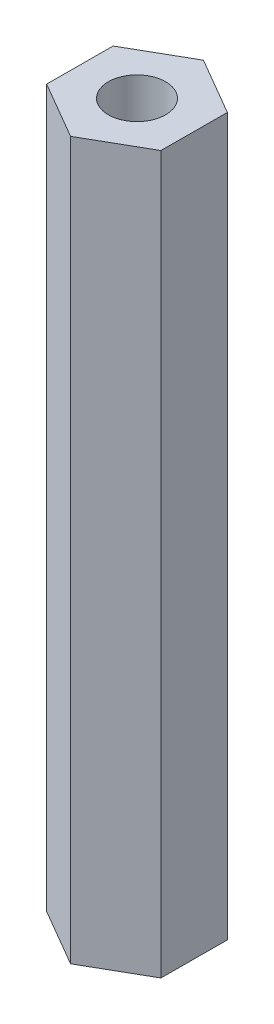
ISO-10303-21;
HEADER;
FILE_DESCRIPTION(('STEP AP214'),'2;1');
FILE_NAME('part.step','',(''),(''),'','','');
FILE_SCHEMA(('AUTOMOTIVE_DESIGN { 1 0 10303 214 1 1 1 1 }'));
ENDSEC;
DATA;
#1=APPLICATION_CONTEXT('core data for automotive mechanical design processes');
#2=APPLICATION_PROTOCOL_DEFINITION('international standard','automotive_design',2000,#1);
#3=PRODUCT_CONTEXT('',#1,'mechanical');
#4=PRODUCT('Part','Part','',(#3));
#5=PRODUCT_RELATED_PRODUCT_CATEGORY('part','',(#4));
#6=PRODUCT_DEFINITION_FORMATION('','',#4);
#7=PRODUCT_DEFINITION_CONTEXT('part definition',#1,'design');
#8=PRODUCT_DEFINITION('design','',#6,#7);
#9=PRODUCT_DEFINITION_SHAPE('','',#8);
#10=(LENGTH_UNIT() NAMED_UNIT(*) SI_UNIT(.MILLI.,.METRE.));
#11=(NAMED_UNIT(*) PLANE_ANGLE_UNIT() SI_UNIT($,.RADIAN.));
#12=(NAMED_UNIT(*) SI_UNIT($,.STERADIAN.) SOLID_ANGLE_UNIT());
#13=UNCERTAINTY_MEASURE_WITH_UNIT(LENGTH_MEASURE(1.E-05),#10,'distance_accuracy_value','');
#14=(GEOMETRIC_REPRESENTATION_CONTEXT(3) GLOBAL_UNCERTAINTY_ASSIGNED_CONTEXT((#13)) GLOBAL_UNIT_ASSIGNED_CONTEXT((#10,
#11,#12)) REPRESENTATION_CONTEXT('',''));
#15=CARTESIAN_POINT('',(0.,0.,0.));
#16=DIRECTION('',(0.,0.,1.));
#17=DIRECTION('',(1.,0.,0.));
#18=AXIS2_PLACEMENT_3D('',#15,#16,#17);
#19=CARTESIAN_POINT('',(0.,5.,0.));
#20=DIRECTION('',(0.,1.,0.));
#21=DIRECTION('',(1.,0.,0.));
#22=AXIS2_PLACEMENT_3D('',#19,#20,#21);
#23=PLANE('',#22);
#24=CARTESIAN_POINT('',(0.,5.,0.));
#25=DIRECTION('',(0.,-1.,0.));
#26=DIRECTION('',(1.,0.,0.));
#27=AXIS2_PLACEMENT_3D('',#24,#25,#26);
#28=CIRCLE('',#27,1.);
#29=CARTESIAN_POINT('',(-1.,5.,0.));
#30=VERTEX_POINT('',#29);
#31=EDGE_CURVE('E154',#30,#30,#28,.T.);
#32=ORIENTED_EDGE('',*,*,#31,.F.);
#33=EDGE_LOOP('',(#32));
#34=FACE_BOUND('',#33,.T.);
#35=DIRECTION('',(-0.867807979731493,0.,0.49689969844461));
#36=VECTOR('',#35,1.);
#37=CARTESIAN_POINT('',(-0.492770226186339,5.,-2.02250113412023));
#38=LINE('',#37,#36);
#39=CARTESIAN_POINT('',(0.00825894451654541,5.,-2.30938630877747));
#40=VERTEX_POINT('',#39);
#41=CARTESIAN_POINT('',(-1.99585773829499,5.,-1.16184561014851));
#42=VERTEX_POINT('',#41);
#43=EDGE_CURVE('E28',#40,#42,#38,.T.);
#44=ORIENTED_EDGE('',*,*,#43,.F.);
#45=DIRECTION('',(-0.864231751851606,0.,-0.503093906832019));
#46=VECTOR('',#45,1.);
#47=CARTESIAN_POINT('',(1.50515224823778,5.,-1.43800210116609));
#48=LINE('',#47,#46);
#49=CARTESIAN_POINT('',(2.00411668281153,5.,-1.14754069862896));
#50=VERTEX_POINT('',#49);
#51=EDGE_CURVE('E123',#50,#40,#48,.T.);
#52=ORIENTED_EDGE('',*,*,#51,.F.);
#53=DIRECTION('',(0.00357622787988714,0.,-0.999993605276629));
#54=VECTOR('',#53,1.);
#55=CARTESIAN_POINT('',(1.99792247442413,5.,0.584499032954142));
#56=LINE('',#55,#54);
#57=CARTESIAN_POINT('',(1.99585773829499,5.,1.16184561014851));
#58=VERTEX_POINT('',#57);
#59=EDGE_CURVE('E116',#58,#50,#56,.T.);
#60=ORIENTED_EDGE('',*,*,#59,.F.);
#61=DIRECTION('',(0.867807979731493,0.,-0.496899698444611));
#62=VECTOR('',#61,1.);
#63=CARTESIAN_POINT('',(0.49277022618634,5.,2.02250113412023));
#64=LINE('',#63,#62);
#65=CARTESIAN_POINT('',(-0.00825894451654438,5.,2.30938630877747));
#66=VERTEX_POINT('',#65);
#67=EDGE_CURVE('E100',#66,#58,#64,.T.);
#68=ORIENTED_EDGE('',*,*,#67,.F.);
#69=DIRECTION('',(0.864231751851606,0.,0.503093906832019));
#70=VECTOR('',#69,1.);
#71=CARTESIAN_POINT('',(-1.50515224823778,5.,1.43800210116609));
#72=LINE('',#71,#70);
#73=CARTESIAN_POINT('',(-2.00411668281153,5.,1.14754069862896));
#74=VERTEX_POINT('',#73);
#75=EDGE_CURVE('E161',#74,#66,#72,.T.);
#76=ORIENTED_EDGE('',*,*,#75,.F.);
#77=DIRECTION('',(-0.00357622787988738,0.,0.999993605276629));
#78=VECTOR('',#77,1.);
#79=CARTESIAN_POINT('',(-1.99792247442413,5.,-0.584499032954142));
#80=LINE('',#79,#78);
#81=EDGE_CURVE('E141',#42,#74,#80,.T.);
#82=ORIENTED_EDGE('',*,*,#81,.F.);
#83=EDGE_LOOP('',(#44,#52,#60,#68,#76,#82));
#84=FACE_BOUND('',#83,.T.);
#85=ADVANCED_FACE('F17',(#34,#84),#23,.F.);
#86=CARTESIAN_POINT('',(0.,30.,0.));
#87=DIRECTION('',(0.,1.,0.));
#88=DIRECTION('',(1.,0.,0.));
#89=AXIS2_PLACEMENT_3D('',#86,#87,#88);
#90=PLANE('',#89);
#91=CARTESIAN_POINT('',(0.,30.,0.));
#92=DIRECTION('',(0.,-1.,0.));
#93=DIRECTION('',(1.,0.,0.));
#94=AXIS2_PLACEMENT_3D('',#91,#92,#93);
#95=CIRCLE('',#94,1.);
#96=CARTESIAN_POINT('',(-1.,30.,0.));
#97=VERTEX_POINT('',#96);
#98=EDGE_CURVE('E73',#97,#97,#95,.T.);
#99=ORIENTED_EDGE('',*,*,#98,.T.);
#100=EDGE_LOOP('',(#99));
#101=FACE_BOUND('',#100,.T.);
#102=DIRECTION('',(-0.867807979731493,0.,0.49689969844461));
#103=VECTOR('',#102,1.);
#104=CARTESIAN_POINT('',(0.00825894451654541,30.,-2.30938630877747));
#105=LINE('',#104,#103);
#106=CARTESIAN_POINT('',(0.00825894451654541,30.,-2.30938630877747));
#107=VERTEX_POINT('',#106);
#108=CARTESIAN_POINT('',(-1.99585773829499,30.,-1.16184561014851));
#109=VERTEX_POINT('',#108);
#110=EDGE_CURVE('E11',#107,#109,#105,.T.);
#111=ORIENTED_EDGE('',*,*,#110,.T.);
#112=DIRECTION('',(-0.00357622787988738,0.,0.999993605276629));
#113=VECTOR('',#112,1.);
#114=CARTESIAN_POINT('',(-1.99585773829499,30.,-1.16184561014851));
#115=LINE('',#114,#113);
#116=CARTESIAN_POINT('',(-2.00411668281153,30.,1.14754069862896));
#117=VERTEX_POINT('',#116);
#118=EDGE_CURVE('E138',#109,#117,#115,.T.);
#119=ORIENTED_EDGE('',*,*,#118,.T.);
#120=DIRECTION('',(0.864231751851606,0.,0.503093906832019));
#121=VECTOR('',#120,1.);
#122=CARTESIAN_POINT('',(-2.00411668281153,30.,1.14754069862896));
#123=LINE('',#122,#121);
#124=CARTESIAN_POINT('',(-0.00825894451654438,30.,2.30938630877747));
#125=VERTEX_POINT('',#124);
#126=EDGE_CURVE('E147',#117,#125,#123,.T.);
#127=ORIENTED_EDGE('',*,*,#126,.T.);
#128=DIRECTION('',(0.867807979731493,0.,-0.49689969844461));
#129=VECTOR('',#128,1.);
#130=CARTESIAN_POINT('',(-0.0082589445165443,30.,2.30938630877747));
#131=LINE('',#130,#129);
#132=CARTESIAN_POINT('',(1.99585773829499,30.,1.16184561014851));
#133=VERTEX_POINT('',#132);
#134=EDGE_CURVE('E111',#125,#133,#131,.T.);
#135=ORIENTED_EDGE('',*,*,#134,.T.);
#136=DIRECTION('',(0.00357622787988714,0.,-0.999993605276629));
#137=VECTOR('',#136,1.);
#138=CARTESIAN_POINT('',(1.99585773829499,30.,1.16184561014851));
#139=LINE('',#138,#137);
#140=CARTESIAN_POINT('',(2.00411668281153,30.,-1.14754069862896));
#141=VERTEX_POINT('',#140);
#142=EDGE_CURVE('E118',#133,#141,#139,.T.);
#143=ORIENTED_EDGE('',*,*,#142,.T.);
#144=DIRECTION('',(-0.864231751851606,0.,-0.503093906832019));
#145=VECTOR('',#144,1.);
#146=CARTESIAN_POINT('',(2.00411668281153,30.,-1.14754069862896));
#147=LINE('',#146,#145);
#148=EDGE_CURVE('E133',#141,#107,#147,.T.);
#149=ORIENTED_EDGE('',*,*,#148,.T.);
#150=EDGE_LOOP('',(#111,#119,#127,#135,#143,#149));
#151=FACE_BOUND('',#150,.T.);
#152=ADVANCED_FACE('F190',(#101,#151),#90,.T.);
#153=CARTESIAN_POINT('',(0.00825894451654541,0.,-2.30938630877747));
#154=DIRECTION('',(-0.49689969844461,0.,-0.867807979731493));
#155=DIRECTION('',(-0.867807979731493,0.,0.49689969844461));
#156=AXIS2_PLACEMENT_3D('',#153,#154,#155);
#157=PLANE('',#156);
#158=ORIENTED_EDGE('',*,*,#43,.T.);
#159=DIRECTION('',(0.,1.,0.));
#160=VECTOR('',#159,1.);
#161=CARTESIAN_POINT('',(-1.99585773829499,0.,-1.16184561014851));
#162=LINE('',#161,#160);
#163=EDGE_CURVE('E140',#42,#109,#162,.T.);
#164=ORIENTED_EDGE('',*,*,#163,.T.);
#165=ORIENTED_EDGE('',*,*,#110,.F.);
#166=DIRECTION('',(0.,1.,0.));
#167=VECTOR('',#166,1.);
#168=CARTESIAN_POINT('',(0.00825894451654541,0.,-2.30938630877747));
#169=LINE('',#168,#167);
#170=EDGE_CURVE('E164',#40,#107,#169,.T.);
#171=ORIENTED_EDGE('',*,*,#170,.F.);
#172=EDGE_LOOP('',(#158,#164,#165,#171));
#173=FACE_BOUND('',#172,.T.);
#174=ADVANCED_FACE('F188',(#173),#157,.T.);
#175=CARTESIAN_POINT('',(-1.99585773829499,0.,-1.16184561014851));
#176=DIRECTION('',(-0.999993605276629,0.,-0.00357622787988738));
#177=DIRECTION('',(-0.00357622787988738,0.,0.999993605276629));
#178=AXIS2_PLACEMENT_3D('',#175,#176,#177);
#179=PLANE('',#178);
#180=ORIENTED_EDGE('',*,*,#81,.T.);
#181=DIRECTION('',(0.,1.,0.));
#182=VECTOR('',#181,1.);
#183=CARTESIAN_POINT('',(-2.00411668281153,0.,1.14754069862896));
#184=LINE('',#183,#182);
#185=EDGE_CURVE('E143',#74,#117,#184,.T.);
#186=ORIENTED_EDGE('',*,*,#185,.T.);
#187=ORIENTED_EDGE('',*,*,#118,.F.);
#188=ORIENTED_EDGE('',*,*,#163,.F.);
#189=EDGE_LOOP('',(#180,#186,#187,#188));
#190=FACE_BOUND('',#189,.T.);
#191=ADVANCED_FACE('F237',(#190),#179,.T.);
#192=CARTESIAN_POINT('',(-2.00411668281153,0.,1.14754069862896));
#193=DIRECTION('',(-0.503093906832019,0.,0.864231751851606));
#194=DIRECTION('',(0.,1.,0.));
#195=AXIS2_PLACEMENT_3D('',#192,#193,#194);
#196=PLANE('',#195);
#197=ORIENTED_EDGE('',*,*,#75,.T.);
#198=DIRECTION('',(0.,1.,0.));
#199=VECTOR('',#198,1.);
#200=CARTESIAN_POINT('',(-0.00825894451654438,0.,2.30938630877747));
#201=LINE('',#200,#199);
#202=EDGE_CURVE('E106',#66,#125,#201,.T.);
#203=ORIENTED_EDGE('',*,*,#202,.T.);
#204=ORIENTED_EDGE('',*,*,#126,.F.);
#205=ORIENTED_EDGE('',*,*,#185,.F.);
#206=EDGE_LOOP('',(#197,#203,#204,#205));
#207=FACE_BOUND('',#206,.T.);
#208=ADVANCED_FACE('F215',(#207),#196,.T.);
#209=CARTESIAN_POINT('',(-0.00825894451654436,0.,2.30938630877747));
#210=DIRECTION('',(0.496899698444611,0.,0.867807979731493));
#211=DIRECTION('',(0.,-1.,0.));
#212=AXIS2_PLACEMENT_3D('',#209,#210,#211);
#213=PLANE('',#212);
#214=ORIENTED_EDGE('',*,*,#67,.T.);
#215=DIRECTION('',(0.,1.,0.));
#216=VECTOR('',#215,1.);
#217=CARTESIAN_POINT('',(1.99585773829499,0.,1.16184561014851));
#218=LINE('',#217,#216);
#219=EDGE_CURVE('E21',#58,#133,#218,.T.);
#220=ORIENTED_EDGE('',*,*,#219,.T.);
#221=ORIENTED_EDGE('',*,*,#134,.F.);
#222=ORIENTED_EDGE('',*,*,#202,.F.);
#223=EDGE_LOOP('',(#214,#220,#221,#222));
#224=FACE_BOUND('',#223,.T.);
#225=ADVANCED_FACE('F102',(#224),#213,.T.);
#226=CARTESIAN_POINT('',(1.99585773829499,0.,1.16184561014851));
#227=DIRECTION('',(0.999993605276629,0.,0.00357622787988714));
#228=DIRECTION('',(0.,-1.,0.));
#229=AXIS2_PLACEMENT_3D('',#226,#227,#228);
#230=PLANE('',#229);
#231=ORIENTED_EDGE('',*,*,#59,.T.);
#232=DIRECTION('',(0.,1.,0.));
#233=VECTOR('',#232,1.);
#234=CARTESIAN_POINT('',(2.00411668281153,0.,-1.14754069862896));
#235=LINE('',#234,#233);
#236=EDGE_CURVE('E125',#50,#141,#235,.T.);
#237=ORIENTED_EDGE('',*,*,#236,.T.);
#238=ORIENTED_EDGE('',*,*,#142,.F.);
#239=ORIENTED_EDGE('',*,*,#219,.F.);
#240=EDGE_LOOP('',(#231,#237,#238,#239));
#241=FACE_BOUND('',#240,.T.);
#242=ADVANCED_FACE('F114',(#241),#230,.T.);
#243=CARTESIAN_POINT('',(2.00411668281153,0.,-1.14754069862896));
#244=DIRECTION('',(0.503093906832019,0.,-0.864231751851606));
#245=DIRECTION('',(0.,-1.,0.));
#246=AXIS2_PLACEMENT_3D('',#243,#244,#245);
#247=PLANE('',#246);
#248=ORIENTED_EDGE('',*,*,#51,.T.);
#249=ORIENTED_EDGE('',*,*,#170,.T.);
#250=ORIENTED_EDGE('',*,*,#148,.F.);
#251=ORIENTED_EDGE('',*,*,#236,.F.);
#252=EDGE_LOOP('',(#248,#249,#250,#251));
#253=FACE_BOUND('',#252,.T.);
#254=ADVANCED_FACE('F19',(#253),#247,.T.);
#255=CARTESIAN_POINT('',(0.,0.,0.));
#256=DIRECTION('',(0.,1.,0.));
#257=DIRECTION('',(1.,0.,0.));
#258=AXIS2_PLACEMENT_3D('',#255,#256,#257);
#259=CYLINDRICAL_SURFACE('',#258,1.);
#260=ORIENTED_EDGE('',*,*,#31,.T.);
#261=DIRECTION('',(0.,1.,0.));
#262=VECTOR('',#261,1.);
#263=CARTESIAN_POINT('',(-1.,0.,0.));
#264=LINE('',#263,#262);
#265=EDGE_CURVE('E84',#30,#97,#264,.T.);
#266=ORIENTED_EDGE('',*,*,#265,.T.);
#267=ORIENTED_EDGE('',*,*,#98,.F.);
#268=ORIENTED_EDGE('',*,*,#265,.F.);
#269=EDGE_LOOP('',(#260,#266,#267,#268));
#270=FACE_BOUND('',#269,.T.);
#271=ADVANCED_FACE('F253',(#270),#259,.F.);
#272=CLOSED_SHELL('',(#85,#152,#174,#191,#208,#225,#242,#254,#271));
#273=MANIFOLD_SOLID_BREP('B1',#272);
#274=ADVANCED_BREP_SHAPE_REPRESENTATION('',(#18,#273),#14);
#275=SHAPE_DEFINITION_REPRESENTATION(#9,#274);
ENDSEC;
END-ISO-10303-21;
